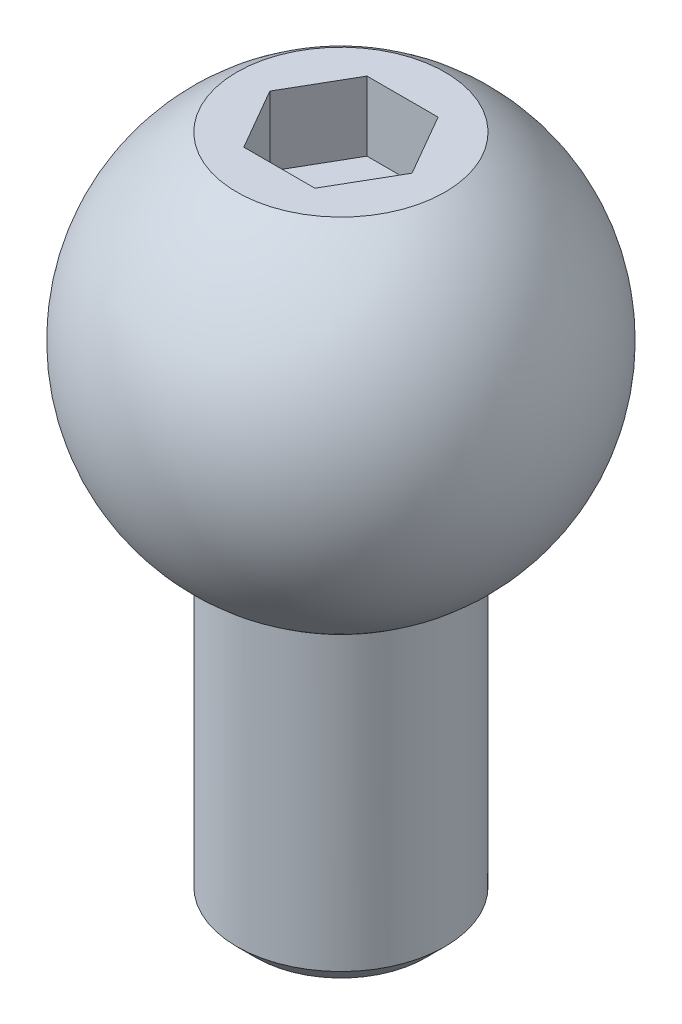
ISO-10303-21;
HEADER;
FILE_DESCRIPTION(('STEP AP214'),'2;1');
FILE_NAME('part.step','',(''),(''),'','','');
FILE_SCHEMA(('AUTOMOTIVE_DESIGN { 1 0 10303 214 1 1 1 1 }'));
ENDSEC;
DATA;
#1=APPLICATION_CONTEXT('core data for automotive mechanical design processes');
#2=APPLICATION_PROTOCOL_DEFINITION('international standard','automotive_design',2000,#1);
#3=PRODUCT_CONTEXT('',#1,'mechanical');
#4=PRODUCT('Part','Part','',(#3));
#5=PRODUCT_RELATED_PRODUCT_CATEGORY('part','',(#4));
#6=PRODUCT_DEFINITION_FORMATION('','',#4);
#7=PRODUCT_DEFINITION_CONTEXT('part definition',#1,'design');
#8=PRODUCT_DEFINITION('design','',#6,#7);
#9=PRODUCT_DEFINITION_SHAPE('','',#8);
#10=(LENGTH_UNIT() NAMED_UNIT(*) SI_UNIT(.MILLI.,.METRE.));
#11=(NAMED_UNIT(*) PLANE_ANGLE_UNIT() SI_UNIT($,.RADIAN.));
#12=(NAMED_UNIT(*) SI_UNIT($,.STERADIAN.) SOLID_ANGLE_UNIT());
#13=UNCERTAINTY_MEASURE_WITH_UNIT(LENGTH_MEASURE(1.E-05),#10,'distance_accuracy_value','');
#14=(GEOMETRIC_REPRESENTATION_CONTEXT(3) GLOBAL_UNCERTAINTY_ASSIGNED_CONTEXT((#13)) GLOBAL_UNIT_ASSIGNED_CONTEXT((#10,
#11,#12)) REPRESENTATION_CONTEXT('',''));
#15=CARTESIAN_POINT('',(0.,0.,0.));
#16=DIRECTION('',(0.,0.,1.));
#17=DIRECTION('',(1.,0.,0.));
#18=AXIS2_PLACEMENT_3D('',#15,#16,#17);
#19=CARTESIAN_POINT('',(0.,-16.5953645799744,0.));
#20=DIRECTION('',(0.,-1.,0.));
#21=DIRECTION('',(0.,0.,-1.));
#22=AXIS2_PLACEMENT_3D('',#19,#20,#21);
#23=CYLINDRICAL_SURFACE('',#22,3.);
#24=CARTESIAN_POINT('',(0.,-16.0408645799744,0.));
#25=DIRECTION('',(0.,1.,0.));
#26=DIRECTION('',(0.,0.,1.));
#27=AXIS2_PLACEMENT_3D('',#24,#25,#26);
#28=CIRCLE('',#27,3.);
#29=CARTESIAN_POINT('',(0.,-16.0408645799744,3.));
#30=VERTEX_POINT('',#29);
#31=EDGE_CURVE('E137',#30,#30,#28,.T.);
#32=ORIENTED_EDGE('',*,*,#31,.T.);
#33=EDGE_LOOP('',(#32));
#34=FACE_BOUND('',#33,.T.);
#35=CARTESIAN_POINT('',(0.,-7.59536457997439,0.));
#36=DIRECTION('',(0.,-1.,0.));
#37=DIRECTION('',(0.,0.,-1.));
#38=AXIS2_PLACEMENT_3D('',#35,#36,#37);
#39=CIRCLE('',#38,3.);
#40=CARTESIAN_POINT('',(3.,-7.59536457997439,0.));
#41=VERTEX_POINT('',#40);
#42=EDGE_CURVE('E11',#41,#41,#39,.T.);
#43=ORIENTED_EDGE('',*,*,#42,.T.);
#44=EDGE_LOOP('',(#43));
#45=FACE_BOUND('',#44,.T.);
#46=ADVANCED_FACE('F46',(#34,#45),#23,.T.);
#47=CARTESIAN_POINT('',(0.,-2.39921215726776,0.));
#48=DIRECTION('',(0.,-1.,0.));
#49=DIRECTION('',(1.,0.,0.));
#50=AXIS2_PLACEMENT_3D('',#47,#48,#49);
#51=SPHERICAL_SURFACE('',#50,6.);
#52=CARTESIAN_POINT('',(0.,2.79694026543887,0.));
#53=DIRECTION('',(0.,-1.,0.));
#54=DIRECTION('',(0.,0.,-1.));
#55=AXIS2_PLACEMENT_3D('',#52,#53,#54);
#56=CIRCLE('',#55,3.);
#57=CARTESIAN_POINT('',(3.,2.79694026543887,0.));
#58=VERTEX_POINT('',#57);
#59=EDGE_CURVE('E53',#58,#58,#56,.T.);
#60=CARTESIAN_POINT('',(3.,2.79694026543887,0.));
#61=CARTESIAN_POINT('',(3.11336610978169,2.7314959043575,0.));
#62=CARTESIAN_POINT('',(3.22458327246489,2.66233095071722,0.));
#63=CARTESIAN_POINT('',(3.44225952377034,2.51688008237781,0.));
#64=CARTESIAN_POINT('',(3.54871861239257,2.44059416767869,0.));
#65=CARTESIAN_POINT('',(3.75641853571208,2.28122160128062,0.));
#66=CARTESIAN_POINT('',(3.85765937040934,2.19813494958167,0.));
#67=CARTESIAN_POINT('',(4.05449041079149,2.02551842563055,0.));
#68=CARTESIAN_POINT('',(4.15008061647637,1.93598855337838,0.));
#69=CARTESIAN_POINT('',(4.3352007577622,1.75086850632467,0.));
#70=CARTESIAN_POINT('',(4.42473069336314,1.65527833152312,0.));
#71=CARTESIAN_POINT('',(4.59734699638458,1.45844713514219,0.));
#72=CARTESIAN_POINT('',(4.68043336380508,1.3572061135628,0.));
#73=CARTESIAN_POINT('',(4.83980671968974,1.14950672000633,0.));
#74=CARTESIAN_POINT('',(4.91609370815391,1.04304834802925,0.));
#75=CARTESIAN_POINT('',(5.06154163947664,0.825370133670464,0.));
#76=CARTESIAN_POINT('',(5.13070258233519,0.714150291288763,0.));
#77=CARTESIAN_POINT('',(5.26160226307807,0.487425394175723,0.));
#78=CARTESIAN_POINT('',(5.3233410009624,0.371920339444385,0.));
#79=CARTESIAN_POINT('',(5.43913189742987,0.137119628648116,0.));
#80=CARTESIAN_POINT('',(5.49318405601301,0.0178239725831858,0.));
#81=CARTESIAN_POINT('',(5.59337033412243,-0.224047098737622,0.));
#82=CARTESIAN_POINT('',(5.6395044536487,-0.346622513993499,0.));
#83=CARTESIAN_POINT('',(5.72365710029257,-0.594528216904075,0.));
#84=CARTESIAN_POINT('',(5.76167562741017,-0.719858504558773,0.));
#85=CARTESIAN_POINT('',(5.82943428805865,-0.972737268746491,0.));
#86=CARTESIAN_POINT('',(5.85917442158954,-1.10028574527951,0.));
#87=CARTESIAN_POINT('',(5.91024894324923,-1.35705470506246,0.));
#88=CARTESIAN_POINT('',(5.93158333137803,-1.4862751883124,0.));
#89=CARTESIAN_POINT('',(5.96575500510769,-1.7458348195825,0.));
#90=CARTESIAN_POINT('',(5.97859229070854,-1.87617396760266,0.));
#91=CARTESIAN_POINT('',(5.9957147881547,-2.13741279617114,0.));
#92=CARTESIAN_POINT('',(6.,-2.26831247671945,0.));
#93=CARTESIAN_POINT('',(6.,-2.53011183781607,0.));
#94=CARTESIAN_POINT('',(5.9957147881547,-2.66101151836438,0.));
#95=CARTESIAN_POINT('',(5.97859229070854,-2.92225034693285,0.));
#96=CARTESIAN_POINT('',(5.96575500510769,-3.05258949495302,0.));
#97=CARTESIAN_POINT('',(5.93158333137803,-3.31214912622311,0.));
#98=CARTESIAN_POINT('',(5.91024894324923,-3.44136960947305,0.));
#99=CARTESIAN_POINT('',(5.85917442158954,-3.698138569256,0.));
#100=CARTESIAN_POINT('',(5.82943428805865,-3.82568704578902,0.));
#101=CARTESIAN_POINT('',(5.76167562741017,-4.07856580997674,0.));
#102=CARTESIAN_POINT('',(5.72365710029257,-4.20389609763144,0.));
#103=CARTESIAN_POINT('',(5.6395044536487,-4.45180180054201,0.));
#104=CARTESIAN_POINT('',(5.59337033412243,-4.57437721579789,0.));
#105=CARTESIAN_POINT('',(5.49318405601301,-4.8162482871187,0.));
#106=CARTESIAN_POINT('',(5.43913189742987,-4.93554394318363,0.));
#107=CARTESIAN_POINT('',(5.3233410009624,-5.1703446539799,0.));
#108=CARTESIAN_POINT('',(5.26160226307807,-5.28584970871124,0.));
#109=CARTESIAN_POINT('',(5.13070258233519,-5.51257460582428,0.));
#110=CARTESIAN_POINT('',(5.06154163947663,-5.62379444820598,0.));
#111=CARTESIAN_POINT('',(4.91609370815391,-5.84147266256476,0.));
#112=CARTESIAN_POINT('',(4.83980671968974,-5.94793103454184,0.));
#113=CARTESIAN_POINT('',(4.68043336380508,-6.15563042809832,0.));
#114=CARTESIAN_POINT('',(4.59734699638459,-6.2568714496777,0.));
#115=CARTESIAN_POINT('',(4.42473069336315,-6.45370264605864,0.));
#116=CARTESIAN_POINT('',(4.3352007577622,-6.54929282086019,0.));
#117=CARTESIAN_POINT('',(4.15008061647637,-6.7344128679139,0.));
#118=CARTESIAN_POINT('',(4.05449041079149,-6.82394274016606,0.));
#119=CARTESIAN_POINT('',(3.85765937040934,-6.99655926411718,0.));
#120=CARTESIAN_POINT('',(3.75641853571208,-7.07964591581613,0.));
#121=CARTESIAN_POINT('',(3.54871861239258,-7.2390184822142,0.));
#122=CARTESIAN_POINT('',(3.44225952377034,-7.31530439691332,0.));
#123=CARTESIAN_POINT('',(3.22458327246489,-7.46075526525273,0.));
#124=CARTESIAN_POINT('',(3.11336610978169,-7.52992021889302,0.));
#125=CARTESIAN_POINT('',(3.,-7.59536457997439,0.));
#126=B_SPLINE_CURVE_WITH_KNOTS('',3,(#60,#61,#62,#63,#64,#65,#66,#67,#68,#69,#70,#71,#72,#73,
#74,#75,#76,#77,#78,#79,#80,#81,#82,#83,#84,#85,#86,#87,#88,#89,#90,#91,#92,#93,#94,#95,#96,#97,
#98,#99,#100,#101,#102,#103,#104,#105,#106,#107,#108,#109,#110,#111,#112,#113,#114,#115,#116,
#117,#118,#119,#120,#121,#122,#123,#124,#125),.UNSPECIFIED.,.F.,.F.,(4,2,2,2,2,2,2,2,2,2,2,2,2,
2,2,2,2,2,2,2,2,2,2,2,2,2,2,2,2,2,2,2,4),(0.,0.392628993861315,0.785257987722628,
1.17788698158394,1.57051597544525,1.96314496930657,2.35577396316788,2.7484029570292,
3.14103195089051,3.53366094475182,3.92628993861314,4.31891893247445,4.71154792633576,
5.10417692019708,5.49680591405839,5.8894349079197,6.28206390178102,6.67469289564233,
7.06732188950365,7.45995088336496,7.85257987722627,8.24520887108759,8.6378378649489,
9.03046685881021,9.42309585267153,9.81572484653284,10.2083538403942,10.6009828342555,
10.9936118281168,11.3862408219781,11.7788698158394,12.1714988097007,12.564127803562),.UNSPECIFIED.);
#127=EDGE_CURVE('BSEAM158',#58,#41,#126,.T.);
#128=ORIENTED_EDGE('',*,*,#59,.T.);
#129=ORIENTED_EDGE('',*,*,#42,.F.);
#130=ORIENTED_EDGE('',*,*,#127,.T.);
#131=ORIENTED_EDGE('',*,*,#127,.F.);
#132=EDGE_LOOP('',(#128,#130,#129,#131));
#133=FACE_BOUND('',#132,.T.);
#134=ADVANCED_FACE('F158',(#133),#51,.T.);
#135=CARTESIAN_POINT('',(0.,2.79694026543887,0.));
#136=DIRECTION('',(0.,1.,0.));
#137=DIRECTION('',(0.,0.,1.));
#138=AXIS2_PLACEMENT_3D('',#135,#136,#137);
#139=PLANE('',#138);
#140=DIRECTION('',(-0.5,0.,0.866025403784439));
#141=VECTOR('',#140,1.);
#142=CARTESIAN_POINT('',(-1.025,2.79694026543887,-1.7753520777581));
#143=LINE('',#142,#141);
#144=CARTESIAN_POINT('',(-1.025,2.79694026543887,-1.7753520777581));
#145=VERTEX_POINT('',#144);
#146=CARTESIAN_POINT('',(-2.05,2.79694026543887,0.));
#147=VERTEX_POINT('',#146);
#148=EDGE_CURVE('E62',#145,#147,#143,.T.);
#149=ORIENTED_EDGE('',*,*,#148,.F.);
#150=DIRECTION('',(-1.,0.,0.));
#151=VECTOR('',#150,1.);
#152=CARTESIAN_POINT('',(1.025,2.79694026543887,-1.7753520777581));
#153=LINE('',#152,#151);
#154=CARTESIAN_POINT('',(1.025,2.79694026543887,-1.7753520777581));
#155=VERTEX_POINT('',#154);
#156=EDGE_CURVE('E143',#155,#145,#153,.T.);
#157=ORIENTED_EDGE('',*,*,#156,.F.);
#158=DIRECTION('',(-0.5,0.,-0.866025403784439));
#159=VECTOR('',#158,1.);
#160=CARTESIAN_POINT('',(2.05,2.79694026543887,0.));
#161=LINE('',#160,#159);
#162=CARTESIAN_POINT('',(2.05,2.79694026543887,0.));
#163=VERTEX_POINT('',#162);
#164=EDGE_CURVE('E145',#163,#155,#161,.T.);
#165=ORIENTED_EDGE('',*,*,#164,.F.);
#166=DIRECTION('',(0.5,0.,-0.866025403784439));
#167=VECTOR('',#166,1.);
#168=CARTESIAN_POINT('',(1.025,2.79694026543887,1.7753520777581));
#169=LINE('',#168,#167);
#170=CARTESIAN_POINT('',(1.025,2.79694026543887,1.7753520777581));
#171=VERTEX_POINT('',#170);
#172=EDGE_CURVE('E107',#171,#163,#169,.T.);
#173=ORIENTED_EDGE('',*,*,#172,.F.);
#174=DIRECTION('',(1.,0.,0.));
#175=VECTOR('',#174,1.);
#176=CARTESIAN_POINT('',(-1.025,2.79694026543887,1.7753520777581));
#177=LINE('',#176,#175);
#178=CARTESIAN_POINT('',(-1.025,2.79694026543887,1.7753520777581));
#179=VERTEX_POINT('',#178);
#180=EDGE_CURVE('E139',#179,#171,#177,.T.);
#181=ORIENTED_EDGE('',*,*,#180,.F.);
#182=DIRECTION('',(0.5,0.,0.866025403784439));
#183=VECTOR('',#182,1.);
#184=CARTESIAN_POINT('',(-2.05,2.79694026543887,0.));
#185=LINE('',#184,#183);
#186=EDGE_CURVE('E131',#147,#179,#185,.T.);
#187=ORIENTED_EDGE('',*,*,#186,.F.);
#188=EDGE_LOOP('',(#149,#157,#165,#173,#181,#187));
#189=FACE_BOUND('',#188,.T.);
#190=ORIENTED_EDGE('',*,*,#59,.F.);
#191=EDGE_LOOP('',(#190));
#192=FACE_BOUND('',#191,.T.);
#193=ADVANCED_FACE('F159',(#189,#192),#139,.T.);
#194=CARTESIAN_POINT('',(-1.025,0.796940265438874,-1.7753520777581));
#195=DIRECTION('',(-0.866025403784439,0.,-0.5));
#196=DIRECTION('',(-0.5,0.,0.866025403784439));
#197=AXIS2_PLACEMENT_3D('',#194,#195,#196);
#198=PLANE('',#197);
#199=ORIENTED_EDGE('',*,*,#148,.T.);
#200=DIRECTION('',(0.,1.,0.));
#201=VECTOR('',#200,1.);
#202=CARTESIAN_POINT('',(-2.05,0.796940265438874,0.));
#203=LINE('',#202,#201);
#204=CARTESIAN_POINT('',(-2.05,0.796940265438874,0.));
#205=VERTEX_POINT('',#204);
#206=EDGE_CURVE('E93',#205,#147,#203,.T.);
#207=ORIENTED_EDGE('',*,*,#206,.F.);
#208=DIRECTION('',(-0.5,0.,0.866025403784439));
#209=VECTOR('',#208,1.);
#210=CARTESIAN_POINT('',(-1.025,0.796940265438874,-1.7753520777581));
#211=LINE('',#210,#209);
#212=CARTESIAN_POINT('',(-1.025,0.796940265438874,-1.7753520777581));
#213=VERTEX_POINT('',#212);
#214=EDGE_CURVE('E149',#213,#205,#211,.T.);
#215=ORIENTED_EDGE('',*,*,#214,.F.);
#216=DIRECTION('',(0.,1.,0.));
#217=VECTOR('',#216,1.);
#218=CARTESIAN_POINT('',(-1.025,0.796940265438874,-1.7753520777581));
#219=LINE('',#218,#217);
#220=EDGE_CURVE('E68',#213,#145,#219,.T.);
#221=ORIENTED_EDGE('',*,*,#220,.T.);
#222=EDGE_LOOP('',(#199,#207,#215,#221));
#223=FACE_BOUND('',#222,.T.);
#224=ADVANCED_FACE('F161',(#223),#198,.F.);
#225=CARTESIAN_POINT('',(1.025,0.796940265438874,-1.7753520777581));
#226=DIRECTION('',(0.,0.,-1.));
#227=DIRECTION('',(-1.,0.,0.));
#228=AXIS2_PLACEMENT_3D('',#225,#226,#227);
#229=PLANE('',#228);
#230=ORIENTED_EDGE('',*,*,#156,.T.);
#231=ORIENTED_EDGE('',*,*,#220,.F.);
#232=DIRECTION('',(-1.,0.,0.));
#233=VECTOR('',#232,1.);
#234=CARTESIAN_POINT('',(1.025,0.796940265438874,-1.7753520777581));
#235=LINE('',#234,#233);
#236=CARTESIAN_POINT('',(1.025,0.796940265438874,-1.7753520777581));
#237=VERTEX_POINT('',#236);
#238=EDGE_CURVE('E122',#237,#213,#235,.T.);
#239=ORIENTED_EDGE('',*,*,#238,.F.);
#240=DIRECTION('',(0.,1.,0.));
#241=VECTOR('',#240,1.);
#242=CARTESIAN_POINT('',(1.025,0.796940265438874,-1.7753520777581));
#243=LINE('',#242,#241);
#244=EDGE_CURVE('E112',#237,#155,#243,.T.);
#245=ORIENTED_EDGE('',*,*,#244,.T.);
#246=EDGE_LOOP('',(#230,#231,#239,#245));
#247=FACE_BOUND('',#246,.T.);
#248=ADVANCED_FACE('F168',(#247),#229,.F.);
#249=CARTESIAN_POINT('',(2.05,0.796940265438874,0.));
#250=DIRECTION('',(0.866025403784438,0.,-0.5));
#251=DIRECTION('',(-0.5,0.,-0.866025403784439));
#252=AXIS2_PLACEMENT_3D('',#249,#250,#251);
#253=PLANE('',#252);
#254=ORIENTED_EDGE('',*,*,#164,.T.);
#255=ORIENTED_EDGE('',*,*,#244,.F.);
#256=DIRECTION('',(-0.5,0.,-0.866025403784439));
#257=VECTOR('',#256,1.);
#258=CARTESIAN_POINT('',(2.05,0.796940265438874,0.));
#259=LINE('',#258,#257);
#260=CARTESIAN_POINT('',(2.05,0.796940265438874,0.));
#261=VERTEX_POINT('',#260);
#262=EDGE_CURVE('E120',#261,#237,#259,.T.);
#263=ORIENTED_EDGE('',*,*,#262,.F.);
#264=DIRECTION('',(0.,1.,0.));
#265=VECTOR('',#264,1.);
#266=CARTESIAN_POINT('',(2.05,0.796940265438874,0.));
#267=LINE('',#266,#265);
#268=EDGE_CURVE('E105',#261,#163,#267,.T.);
#269=ORIENTED_EDGE('',*,*,#268,.T.);
#270=EDGE_LOOP('',(#254,#255,#263,#269));
#271=FACE_BOUND('',#270,.T.);
#272=ADVANCED_FACE('F119',(#271),#253,.F.);
#273=CARTESIAN_POINT('',(1.025,0.796940265438874,1.7753520777581));
#274=DIRECTION('',(0.866025403784439,0.,0.5));
#275=DIRECTION('',(0.5,0.,-0.866025403784439));
#276=AXIS2_PLACEMENT_3D('',#273,#274,#275);
#277=PLANE('',#276);
#278=ORIENTED_EDGE('',*,*,#172,.T.);
#279=ORIENTED_EDGE('',*,*,#268,.F.);
#280=DIRECTION('',(0.5,0.,-0.866025403784439));
#281=VECTOR('',#280,1.);
#282=CARTESIAN_POINT('',(1.025,0.796940265438874,1.7753520777581));
#283=LINE('',#282,#281);
#284=CARTESIAN_POINT('',(1.025,0.796940265438874,1.7753520777581));
#285=VERTEX_POINT('',#284);
#286=EDGE_CURVE('E106',#285,#261,#283,.T.);
#287=ORIENTED_EDGE('',*,*,#286,.F.);
#288=DIRECTION('',(0.,1.,0.));
#289=VECTOR('',#288,1.);
#290=CARTESIAN_POINT('',(1.025,0.796940265438874,1.7753520777581));
#291=LINE('',#290,#289);
#292=EDGE_CURVE('E113',#285,#171,#291,.T.);
#293=ORIENTED_EDGE('',*,*,#292,.T.);
#294=EDGE_LOOP('',(#278,#279,#287,#293));
#295=FACE_BOUND('',#294,.T.);
#296=ADVANCED_FACE('F102',(#295),#277,.F.);
#297=CARTESIAN_POINT('',(-1.025,0.796940265438874,1.7753520777581));
#298=DIRECTION('',(0.,0.,1.));
#299=DIRECTION('',(1.,0.,0.));
#300=AXIS2_PLACEMENT_3D('',#297,#298,#299);
#301=PLANE('',#300);
#302=ORIENTED_EDGE('',*,*,#180,.T.);
#303=ORIENTED_EDGE('',*,*,#292,.F.);
#304=DIRECTION('',(1.,0.,0.));
#305=VECTOR('',#304,1.);
#306=CARTESIAN_POINT('',(-1.025,0.796940265438874,1.7753520777581));
#307=LINE('',#306,#305);
#308=CARTESIAN_POINT('',(-1.025,0.796940265438874,1.7753520777581));
#309=VERTEX_POINT('',#308);
#310=EDGE_CURVE('E130',#309,#285,#307,.T.);
#311=ORIENTED_EDGE('',*,*,#310,.F.);
#312=DIRECTION('',(0.,1.,0.));
#313=VECTOR('',#312,1.);
#314=CARTESIAN_POINT('',(-1.025,0.796940265438874,1.7753520777581));
#315=LINE('',#314,#313);
#316=EDGE_CURVE('E153',#309,#179,#315,.T.);
#317=ORIENTED_EDGE('',*,*,#316,.T.);
#318=EDGE_LOOP('',(#302,#303,#311,#317));
#319=FACE_BOUND('',#318,.T.);
#320=ADVANCED_FACE('F192',(#319),#301,.F.);
#321=CARTESIAN_POINT('',(-2.05,0.796940265438874,0.));
#322=DIRECTION('',(-0.866025403784439,0.,0.5));
#323=DIRECTION('',(0.5,0.,0.866025403784439));
#324=AXIS2_PLACEMENT_3D('',#321,#322,#323);
#325=PLANE('',#324);
#326=ORIENTED_EDGE('',*,*,#186,.T.);
#327=ORIENTED_EDGE('',*,*,#316,.F.);
#328=DIRECTION('',(0.5,0.,0.866025403784439));
#329=VECTOR('',#328,1.);
#330=CARTESIAN_POINT('',(-2.05,0.796940265438874,0.));
#331=LINE('',#330,#329);
#332=EDGE_CURVE('E128',#205,#309,#331,.T.);
#333=ORIENTED_EDGE('',*,*,#332,.F.);
#334=ORIENTED_EDGE('',*,*,#206,.T.);
#335=EDGE_LOOP('',(#326,#327,#333,#334));
#336=FACE_BOUND('',#335,.T.);
#337=ADVANCED_FACE('F190',(#336),#325,.F.);
#338=CARTESIAN_POINT('',(0.,0.796940265438874,0.));
#339=DIRECTION('',(0.,1.,0.));
#340=DIRECTION('',(0.,0.,1.));
#341=AXIS2_PLACEMENT_3D('',#338,#339,#340);
#342=PLANE('',#341);
#343=ORIENTED_EDGE('',*,*,#214,.T.);
#344=ORIENTED_EDGE('',*,*,#332,.T.);
#345=ORIENTED_EDGE('',*,*,#310,.T.);
#346=ORIENTED_EDGE('',*,*,#286,.T.);
#347=ORIENTED_EDGE('',*,*,#262,.T.);
#348=ORIENTED_EDGE('',*,*,#238,.T.);
#349=EDGE_LOOP('',(#343,#344,#345,#346,#347,#348));
#350=FACE_BOUND('',#349,.T.);
#351=ADVANCED_FACE('F121',(#350),#342,.T.);
#352=CARTESIAN_POINT('',(0.,-16.5953645799744,0.));
#353=DIRECTION('',(0.,1.,0.));
#354=DIRECTION('',(0.,0.,1.));
#355=AXIS2_PLACEMENT_3D('',#352,#353,#354);
#356=CONICAL_SURFACE('',#355,2.4455,0.785398163397464);
#357=ORIENTED_EDGE('',*,*,#31,.F.);
#358=EDGE_LOOP('',(#357));
#359=FACE_BOUND('',#358,.T.);
#360=CARTESIAN_POINT('',(0.,-16.5953645799744,0.));
#361=DIRECTION('',(0.,1.,0.));
#362=DIRECTION('',(0.,0.,1.));
#363=AXIS2_PLACEMENT_3D('',#360,#361,#362);
#364=CIRCLE('',#363,2.4455);
#365=CARTESIAN_POINT('',(0.,-16.5953645799744,2.4455));
#366=VERTEX_POINT('',#365);
#367=EDGE_CURVE('E182',#366,#366,#364,.T.);
#368=ORIENTED_EDGE('',*,*,#367,.T.);
#369=EDGE_LOOP('',(#368));
#370=FACE_BOUND('',#369,.T.);
#371=ADVANCED_FACE('F208',(#359,#370),#356,.T.);
#372=CARTESIAN_POINT('',(0.,-16.5953645799744,0.));
#373=DIRECTION('',(0.,-1.,0.));
#374=DIRECTION('',(0.,0.,-1.));
#375=AXIS2_PLACEMENT_3D('',#372,#373,#374);
#376=PLANE('',#375);
#377=ORIENTED_EDGE('',*,*,#367,.F.);
#378=EDGE_LOOP('',(#377));
#379=FACE_BOUND('',#378,.T.);
#380=ADVANCED_FACE('F48',(#379),#376,.T.);
#381=CLOSED_SHELL('',(#46,#134,#193,#224,#248,#272,#296,#320,#337,#351,#371,#380));
#382=MANIFOLD_SOLID_BREP('B2',#381);
#383=ADVANCED_BREP_SHAPE_REPRESENTATION('',(#18,#382),#14);
#384=SHAPE_DEFINITION_REPRESENTATION(#9,#383);
ENDSEC;
END-ISO-10303-21;
